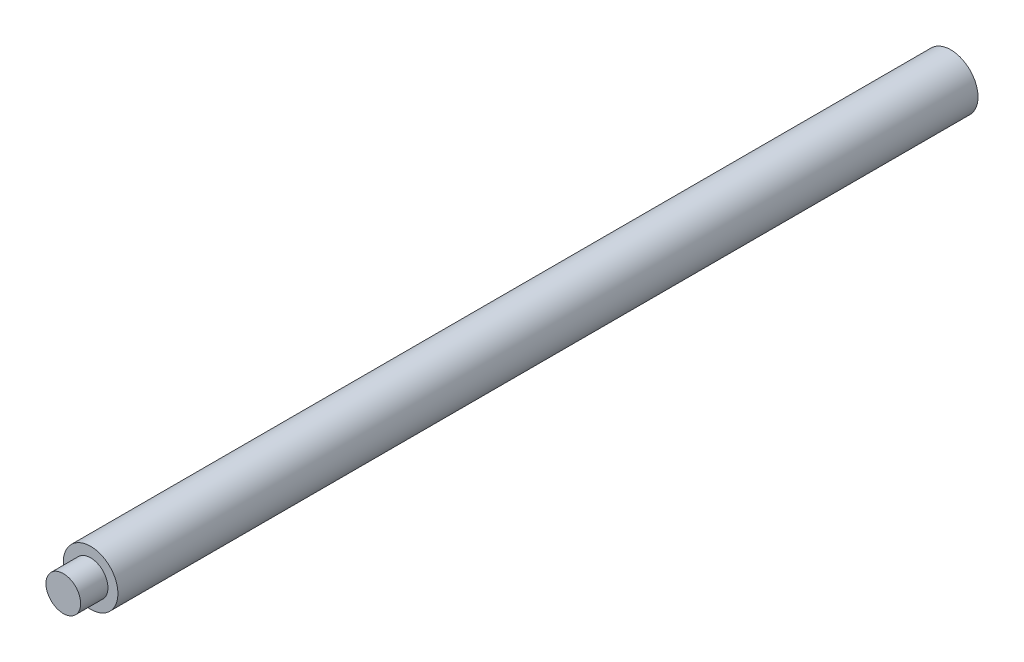
ISO-10303-21;
HEADER;
FILE_DESCRIPTION(('STEP AP214'),'2;1');
FILE_NAME('part.step','',(''),(''),'','','');
FILE_SCHEMA(('AUTOMOTIVE_DESIGN { 1 0 10303 214 1 1 1 1 }'));
ENDSEC;
DATA;
#1=APPLICATION_CONTEXT('core data for automotive mechanical design processes');
#2=APPLICATION_PROTOCOL_DEFINITION('international standard','automotive_design',2000,#1);
#3=PRODUCT_CONTEXT('',#1,'mechanical');
#4=PRODUCT('Part','Part','',(#3));
#5=PRODUCT_RELATED_PRODUCT_CATEGORY('part','',(#4));
#6=PRODUCT_DEFINITION_FORMATION('','',#4);
#7=PRODUCT_DEFINITION_CONTEXT('part definition',#1,'design');
#8=PRODUCT_DEFINITION('design','',#6,#7);
#9=PRODUCT_DEFINITION_SHAPE('','',#8);
#10=(LENGTH_UNIT() NAMED_UNIT(*) SI_UNIT(.MILLI.,.METRE.));
#11=(NAMED_UNIT(*) PLANE_ANGLE_UNIT() SI_UNIT($,.RADIAN.));
#12=(NAMED_UNIT(*) SI_UNIT($,.STERADIAN.) SOLID_ANGLE_UNIT());
#13=UNCERTAINTY_MEASURE_WITH_UNIT(LENGTH_MEASURE(1.E-05),#10,'distance_accuracy_value','');
#14=(GEOMETRIC_REPRESENTATION_CONTEXT(3) GLOBAL_UNCERTAINTY_ASSIGNED_CONTEXT((#13)) GLOBAL_UNIT_ASSIGNED_CONTEXT((#10,
#11,#12)) REPRESENTATION_CONTEXT('',''));
#15=CARTESIAN_POINT('',(0.,0.,0.));
#16=DIRECTION('',(0.,0.,1.));
#17=DIRECTION('',(1.,0.,0.));
#18=AXIS2_PLACEMENT_3D('',#15,#16,#17);
#19=CARTESIAN_POINT('',(0.,0.,0.));
#20=DIRECTION('',(0.,0.,1.));
#21=DIRECTION('',(1.,0.,0.));
#22=AXIS2_PLACEMENT_3D('',#19,#20,#21);
#23=PLANE('',#22);
#24=CARTESIAN_POINT('',(0.,0.,0.));
#25=DIRECTION('',(0.,0.,1.));
#26=DIRECTION('',(1.,0.,0.));
#27=AXIS2_PLACEMENT_3D('',#24,#25,#26);
#28=CIRCLE('',#27,10.);
#29=CARTESIAN_POINT('',(10.,0.,0.));
#30=VERTEX_POINT('',#29);
#31=EDGE_CURVE('E41',#30,#30,#28,.T.);
#32=ORIENTED_EDGE('',*,*,#31,.F.);
#33=EDGE_LOOP('',(#32));
#34=FACE_BOUND('',#33,.T.);
#35=CARTESIAN_POINT('',(0.,0.,0.));
#36=DIRECTION('',(0.,0.,1.));
#37=DIRECTION('',(1.,0.,0.));
#38=AXIS2_PLACEMENT_3D('',#35,#36,#37);
#39=CIRCLE('',#38,8.);
#40=CARTESIAN_POINT('',(8.,0.,0.));
#41=VERTEX_POINT('',#40);
#42=EDGE_CURVE('E49',#41,#41,#39,.T.);
#43=ORIENTED_EDGE('',*,*,#42,.T.);
#44=EDGE_LOOP('',(#43));
#45=FACE_BOUND('',#44,.T.);
#46=ADVANCED_FACE('F37',(#34,#45),#23,.F.);
#47=CARTESIAN_POINT('',(0.,0.,305.));
#48=DIRECTION('',(0.,0.,-1.));
#49=DIRECTION('',(-1.,0.,0.));
#50=AXIS2_PLACEMENT_3D('',#47,#48,#49);
#51=CYLINDRICAL_SURFACE('',#50,10.);
#52=ORIENTED_EDGE('',*,*,#31,.T.);
#53=EDGE_LOOP('',(#52));
#54=FACE_BOUND('',#53,.T.);
#55=CARTESIAN_POINT('',(0.,0.,315.));
#56=DIRECTION('',(0.,0.,1.));
#57=DIRECTION('',(1.,0.,0.));
#58=AXIS2_PLACEMENT_3D('',#55,#56,#57);
#59=CIRCLE('',#58,10.);
#60=CARTESIAN_POINT('',(10.,0.,315.));
#61=VERTEX_POINT('',#60);
#62=EDGE_CURVE('E53',#61,#61,#59,.T.);
#63=ORIENTED_EDGE('',*,*,#62,.F.);
#64=EDGE_LOOP('',(#63));
#65=FACE_BOUND('',#64,.T.);
#66=ADVANCED_FACE('F39',(#54,#65),#51,.T.);
#67=CARTESIAN_POINT('',(0.,0.,305.));
#68=DIRECTION('',(0.,0.,-1.));
#69=DIRECTION('',(-1.,0.,0.));
#70=AXIS2_PLACEMENT_3D('',#67,#68,#69);
#71=CYLINDRICAL_SURFACE('',#70,8.);
#72=CARTESIAN_POINT('',(0.,0.,305.));
#73=DIRECTION('',(0.,0.,1.));
#74=DIRECTION('',(1.,0.,0.));
#75=AXIS2_PLACEMENT_3D('',#72,#73,#74);
#76=CIRCLE('',#75,8.);
#77=CARTESIAN_POINT('',(8.,0.,305.));
#78=VERTEX_POINT('',#77);
#79=EDGE_CURVE('E56',#78,#78,#76,.T.);
#80=ORIENTED_EDGE('',*,*,#79,.T.);
#81=EDGE_LOOP('',(#80));
#82=FACE_BOUND('',#81,.T.);
#83=ORIENTED_EDGE('',*,*,#42,.F.);
#84=EDGE_LOOP('',(#83));
#85=FACE_BOUND('',#84,.T.);
#86=ADVANCED_FACE('F62',(#82,#85),#71,.F.);
#87=CARTESIAN_POINT('',(0.,0.,305.));
#88=DIRECTION('',(0.,0.,1.));
#89=DIRECTION('',(1.,0.,0.));
#90=AXIS2_PLACEMENT_3D('',#87,#88,#89);
#91=PLANE('',#90);
#92=ORIENTED_EDGE('',*,*,#79,.F.);
#93=EDGE_LOOP('',(#92));
#94=FACE_BOUND('',#93,.T.);
#95=ADVANCED_FACE('F64',(#94),#91,.F.);
#96=CARTESIAN_POINT('',(0.,0.,315.));
#97=DIRECTION('',(0.,0.,1.));
#98=DIRECTION('',(1.,0.,0.));
#99=AXIS2_PLACEMENT_3D('',#96,#97,#98);
#100=PLANE('',#99);
#101=CARTESIAN_POINT('',(0.,0.,315.));
#102=DIRECTION('',(0.,0.,1.));
#103=DIRECTION('',(1.,0.,0.));
#104=AXIS2_PLACEMENT_3D('',#101,#102,#103);
#105=CIRCLE('',#104,6.35);
#106=CARTESIAN_POINT('',(6.35,0.,315.));
#107=VERTEX_POINT('',#106);
#108=EDGE_CURVE('E10',#107,#107,#105,.T.);
#109=ORIENTED_EDGE('',*,*,#108,.F.);
#110=EDGE_LOOP('',(#109));
#111=FACE_BOUND('',#110,.T.);
#112=ORIENTED_EDGE('',*,*,#62,.T.);
#113=EDGE_LOOP('',(#112));
#114=FACE_BOUND('',#113,.T.);
#115=ADVANCED_FACE('F71',(#111,#114),#100,.T.);
#116=CARTESIAN_POINT('',(0.,0.,325.));
#117=DIRECTION('',(0.,0.,-1.));
#118=DIRECTION('',(-1.,0.,0.));
#119=AXIS2_PLACEMENT_3D('',#116,#117,#118);
#120=CYLINDRICAL_SURFACE('',#119,6.35);
#121=CARTESIAN_POINT('',(0.,0.,325.));
#122=DIRECTION('',(0.,0.,1.));
#123=DIRECTION('',(1.,0.,0.));
#124=AXIS2_PLACEMENT_3D('',#121,#122,#123);
#125=CIRCLE('',#124,6.35);
#126=CARTESIAN_POINT('',(6.35,0.,325.));
#127=VERTEX_POINT('',#126);
#128=EDGE_CURVE('E52',#127,#127,#125,.T.);
#129=ORIENTED_EDGE('',*,*,#128,.F.);
#130=EDGE_LOOP('',(#129));
#131=FACE_BOUND('',#130,.T.);
#132=ORIENTED_EDGE('',*,*,#108,.T.);
#133=EDGE_LOOP('',(#132));
#134=FACE_BOUND('',#133,.T.);
#135=ADVANCED_FACE('F84',(#131,#134),#120,.T.);
#136=CARTESIAN_POINT('',(0.,0.,325.));
#137=DIRECTION('',(0.,0.,1.));
#138=DIRECTION('',(1.,0.,0.));
#139=AXIS2_PLACEMENT_3D('',#136,#137,#138);
#140=PLANE('',#139);
#141=ORIENTED_EDGE('',*,*,#128,.T.);
#142=EDGE_LOOP('',(#141));
#143=FACE_BOUND('',#142,.T.);
#144=ADVANCED_FACE('F90',(#143),#140,.T.);
#145=CLOSED_SHELL('',(#46,#66,#86,#95,#115,#135,#144));
#146=MANIFOLD_SOLID_BREP('B2',#145);
#147=ADVANCED_BREP_SHAPE_REPRESENTATION('',(#18,#146),#14);
#148=SHAPE_DEFINITION_REPRESENTATION(#9,#147);
ENDSEC;
END-ISO-10303-21;
